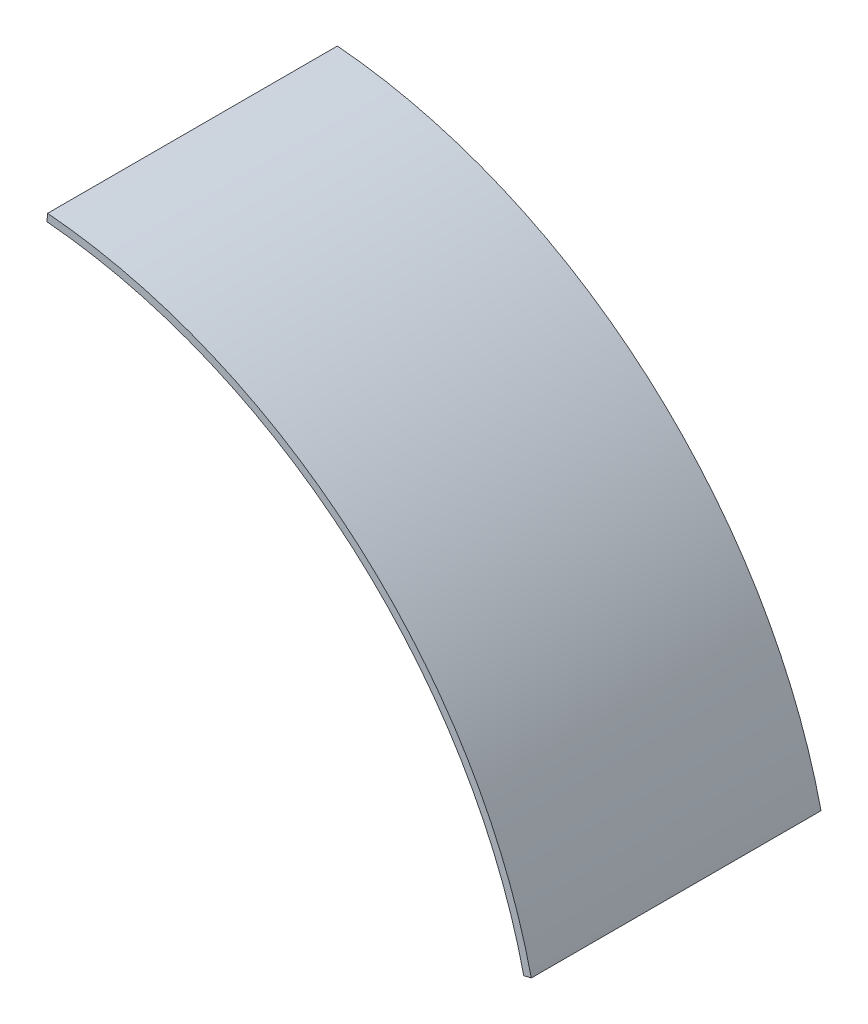
ISO-10303-21;
HEADER;
FILE_DESCRIPTION(('STEP AP214'),'2;1');
FILE_NAME('part.step','',(''),(''),'','','');
FILE_SCHEMA(('AUTOMOTIVE_DESIGN { 1 0 10303 214 1 1 1 1 }'));
ENDSEC;
DATA;
#1=APPLICATION_CONTEXT('core data for automotive mechanical design processes');
#2=APPLICATION_PROTOCOL_DEFINITION('international standard','automotive_design',2000,#1);
#3=PRODUCT_CONTEXT('',#1,'mechanical');
#4=PRODUCT('Part','Part','',(#3));
#5=PRODUCT_RELATED_PRODUCT_CATEGORY('part','',(#4));
#6=PRODUCT_DEFINITION_FORMATION('','',#4);
#7=PRODUCT_DEFINITION_CONTEXT('part definition',#1,'design');
#8=PRODUCT_DEFINITION('design','',#6,#7);
#9=PRODUCT_DEFINITION_SHAPE('','',#8);
#10=(LENGTH_UNIT() NAMED_UNIT(*) SI_UNIT(.MILLI.,.METRE.));
#11=(NAMED_UNIT(*) PLANE_ANGLE_UNIT() SI_UNIT($,.RADIAN.));
#12=(NAMED_UNIT(*) SI_UNIT($,.STERADIAN.) SOLID_ANGLE_UNIT());
#13=UNCERTAINTY_MEASURE_WITH_UNIT(LENGTH_MEASURE(1.E-05),#10,'distance_accuracy_value','');
#14=(GEOMETRIC_REPRESENTATION_CONTEXT(3) GLOBAL_UNCERTAINTY_ASSIGNED_CONTEXT((#13)) GLOBAL_UNIT_ASSIGNED_CONTEXT((#10,
#11,#12)) REPRESENTATION_CONTEXT('',''));
#15=CARTESIAN_POINT('',(0.,0.,0.));
#16=DIRECTION('',(0.,0.,1.));
#17=DIRECTION('',(1.,0.,0.));
#18=AXIS2_PLACEMENT_3D('',#15,#16,#17);
#19=CARTESIAN_POINT('',(0.,0.,-375.));
#20=DIRECTION('',(0.,0.,1.));
#21=DIRECTION('',(1.,0.,0.));
#22=AXIS2_PLACEMENT_3D('',#19,#20,#21);
#23=CYLINDRICAL_SURFACE('',#22,695.);
#24=CARTESIAN_POINT('',(0.,0.,0.));
#25=DIRECTION('',(0.,0.,-1.));
#26=DIRECTION('',(-1.,0.,0.));
#27=AXIS2_PLACEMENT_3D('',#24,#25,#26);
#28=CIRCLE('',#27,695.);
#29=CARTESIAN_POINT('',(60.1880089722461,692.388910639069,0.));
#30=VERTEX_POINT('',#29);
#31=CARTESIAN_POINT('',(677.274077507345,155.964175170371,0.));
#32=VERTEX_POINT('',#31);
#33=EDGE_CURVE('E96',#30,#32,#28,.T.);
#34=ORIENTED_EDGE('',*,*,#33,.F.);
#35=DIRECTION('',(0.,0.,1.));
#36=VECTOR('',#35,1.);
#37=CARTESIAN_POINT('',(60.1880089722461,692.388910639069,-375.));
#38=LINE('',#37,#36);
#39=CARTESIAN_POINT('',(60.1880089722461,692.388910639069,-375.));
#40=VERTEX_POINT('',#39);
#41=EDGE_CURVE('E11',#40,#30,#38,.T.);
#42=ORIENTED_EDGE('',*,*,#41,.F.);
#43=CARTESIAN_POINT('',(0.,0.,-375.));
#44=DIRECTION('',(0.,0.,-1.));
#45=DIRECTION('',(-1.,0.,0.));
#46=AXIS2_PLACEMENT_3D('',#43,#44,#45);
#47=CIRCLE('',#46,695.);
#48=CARTESIAN_POINT('',(677.274077507345,155.964175170371,-375.));
#49=VERTEX_POINT('',#48);
#50=EDGE_CURVE('E90',#40,#49,#47,.T.);
#51=ORIENTED_EDGE('',*,*,#50,.T.);
#52=DIRECTION('',(0.,0.,1.));
#53=VECTOR('',#52,1.);
#54=CARTESIAN_POINT('',(677.274077507345,155.964175170371,-375.));
#55=LINE('',#54,#53);
#56=EDGE_CURVE('E35',#49,#32,#55,.T.);
#57=ORIENTED_EDGE('',*,*,#56,.T.);
#58=EDGE_LOOP('',(#34,#42,#51,#57));
#59=FACE_BOUND('',#58,.T.);
#60=ADVANCED_FACE('F32',(#59),#23,.F.);
#61=CARTESIAN_POINT('',(61.0540234898324,702.351341007976,-375.));
#62=DIRECTION('',(-0.996243036890747,0.0866014517586281,0.));
#63=DIRECTION('',(-0.0866014517586281,-0.996243036890747,0.));
#64=AXIS2_PLACEMENT_3D('',#61,#62,#63);
#65=PLANE('',#64);
#66=DIRECTION('',(-0.0866014517586281,-0.996243036890747,0.));
#67=VECTOR('',#66,1.);
#68=CARTESIAN_POINT('',(61.0540234898324,702.351341007976,0.));
#69=LINE('',#68,#67);
#70=CARTESIAN_POINT('',(61.0540234898323,702.351341007976,0.));
#71=VERTEX_POINT('',#70);
#72=EDGE_CURVE('E92',#71,#30,#69,.T.);
#73=ORIENTED_EDGE('',*,*,#72,.F.);
#74=DIRECTION('',(0.,0.,1.));
#75=VECTOR('',#74,1.);
#76=CARTESIAN_POINT('',(61.0540234898323,702.351341007976,-375.));
#77=LINE('',#76,#75);
#78=CARTESIAN_POINT('',(61.0540234898323,702.351341007976,-375.));
#79=VERTEX_POINT('',#78);
#80=EDGE_CURVE('E41',#79,#71,#77,.T.);
#81=ORIENTED_EDGE('',*,*,#80,.F.);
#82=DIRECTION('',(-0.0866014517586281,-0.996243036890747,0.));
#83=VECTOR('',#82,1.);
#84=CARTESIAN_POINT('',(61.0540234898324,702.351341007976,-375.));
#85=LINE('',#84,#83);
#86=EDGE_CURVE('E87',#79,#40,#85,.T.);
#87=ORIENTED_EDGE('',*,*,#86,.T.);
#88=ORIENTED_EDGE('',*,*,#41,.T.);
#89=EDGE_LOOP('',(#73,#81,#87,#88));
#90=FACE_BOUND('',#89,.T.);
#91=ADVANCED_FACE('F106',(#90),#65,.T.);
#92=CARTESIAN_POINT('',(0.,0.,-375.));
#93=DIRECTION('',(0.,0.,1.));
#94=DIRECTION('',(1.,0.,0.));
#95=AXIS2_PLACEMENT_3D('',#92,#93,#94);
#96=CYLINDRICAL_SURFACE('',#95,705.);
#97=CARTESIAN_POINT('',(0.,0.,0.));
#98=DIRECTION('',(0.,0.,1.));
#99=DIRECTION('',(1.,0.,0.));
#100=AXIS2_PLACEMENT_3D('',#97,#98,#99);
#101=CIRCLE('',#100,705.);
#102=CARTESIAN_POINT('',(687.019028262847,158.208264021743,0.));
#103=VERTEX_POINT('',#102);
#104=EDGE_CURVE('E82',#103,#71,#101,.T.);
#105=ORIENTED_EDGE('',*,*,#104,.F.);
#106=DIRECTION('',(0.,0.,1.));
#107=VECTOR('',#106,1.);
#108=CARTESIAN_POINT('',(687.019028262847,158.208264021743,-375.));
#109=LINE('',#108,#107);
#110=CARTESIAN_POINT('',(687.019028262847,158.208264021743,-375.));
#111=VERTEX_POINT('',#110);
#112=EDGE_CURVE('E77',#111,#103,#109,.T.);
#113=ORIENTED_EDGE('',*,*,#112,.F.);
#114=CARTESIAN_POINT('',(0.,0.,-375.));
#115=DIRECTION('',(0.,0.,1.));
#116=DIRECTION('',(1.,0.,0.));
#117=AXIS2_PLACEMENT_3D('',#114,#115,#116);
#118=CIRCLE('',#117,705.);
#119=EDGE_CURVE('E80',#111,#79,#118,.T.);
#120=ORIENTED_EDGE('',*,*,#119,.T.);
#121=ORIENTED_EDGE('',*,*,#80,.T.);
#122=EDGE_LOOP('',(#105,#113,#120,#121));
#123=FACE_BOUND('',#122,.T.);
#124=ADVANCED_FACE('F79',(#123),#96,.T.);
#125=CARTESIAN_POINT('',(687.019028262847,158.208264021743,-375.));
#126=DIRECTION('',(0.224408885137224,-0.974495075550137,0.));
#127=DIRECTION('',(0.974495075550137,0.224408885137224,0.));
#128=AXIS2_PLACEMENT_3D('',#125,#126,#127);
#129=PLANE('',#128);
#130=DIRECTION('',(0.974495075550137,0.224408885137224,0.));
#131=VECTOR('',#130,1.);
#132=CARTESIAN_POINT('',(687.019028262847,158.208264021743,0.));
#133=LINE('',#132,#131);
#134=EDGE_CURVE('E99',#32,#103,#133,.T.);
#135=ORIENTED_EDGE('',*,*,#134,.F.);
#136=ORIENTED_EDGE('',*,*,#56,.F.);
#137=DIRECTION('',(0.974495075550137,0.224408885137224,0.));
#138=VECTOR('',#137,1.);
#139=CARTESIAN_POINT('',(687.019028262847,158.208264021743,-375.));
#140=LINE('',#139,#138);
#141=EDGE_CURVE('E86',#49,#111,#140,.T.);
#142=ORIENTED_EDGE('',*,*,#141,.T.);
#143=ORIENTED_EDGE('',*,*,#112,.T.);
#144=EDGE_LOOP('',(#135,#136,#142,#143));
#145=FACE_BOUND('',#144,.T.);
#146=ADVANCED_FACE('F89',(#145),#129,.T.);
#147=CARTESIAN_POINT('',(0.,0.,-375.));
#148=DIRECTION('',(0.,0.,-1.));
#149=DIRECTION('',(-1.,0.,0.));
#150=AXIS2_PLACEMENT_3D('',#147,#148,#149);
#151=PLANE('',#150);
#152=ORIENTED_EDGE('',*,*,#50,.F.);
#153=ORIENTED_EDGE('',*,*,#86,.F.);
#154=ORIENTED_EDGE('',*,*,#119,.F.);
#155=ORIENTED_EDGE('',*,*,#141,.F.);
#156=EDGE_LOOP('',(#152,#153,#154,#155));
#157=FACE_BOUND('',#156,.T.);
#158=ADVANCED_FACE('F85',(#157),#151,.T.);
#159=CARTESIAN_POINT('',(0.,0.,0.));
#160=DIRECTION('',(0.,0.,-1.));
#161=DIRECTION('',(-1.,0.,0.));
#162=AXIS2_PLACEMENT_3D('',#159,#160,#161);
#163=PLANE('',#162);
#164=ORIENTED_EDGE('',*,*,#33,.T.);
#165=ORIENTED_EDGE('',*,*,#134,.T.);
#166=ORIENTED_EDGE('',*,*,#104,.T.);
#167=ORIENTED_EDGE('',*,*,#72,.T.);
#168=EDGE_LOOP('',(#164,#165,#166,#167));
#169=FACE_BOUND('',#168,.T.);
#170=ADVANCED_FACE('F105',(#169),#163,.F.);
#171=CLOSED_SHELL('',(#60,#91,#124,#146,#158,#170));
#172=MANIFOLD_SOLID_BREP('B2',#171);
#173=ADVANCED_BREP_SHAPE_REPRESENTATION('',(#18,#172),#14);
#174=SHAPE_DEFINITION_REPRESENTATION(#9,#173);
ENDSEC;
END-ISO-10303-21;
